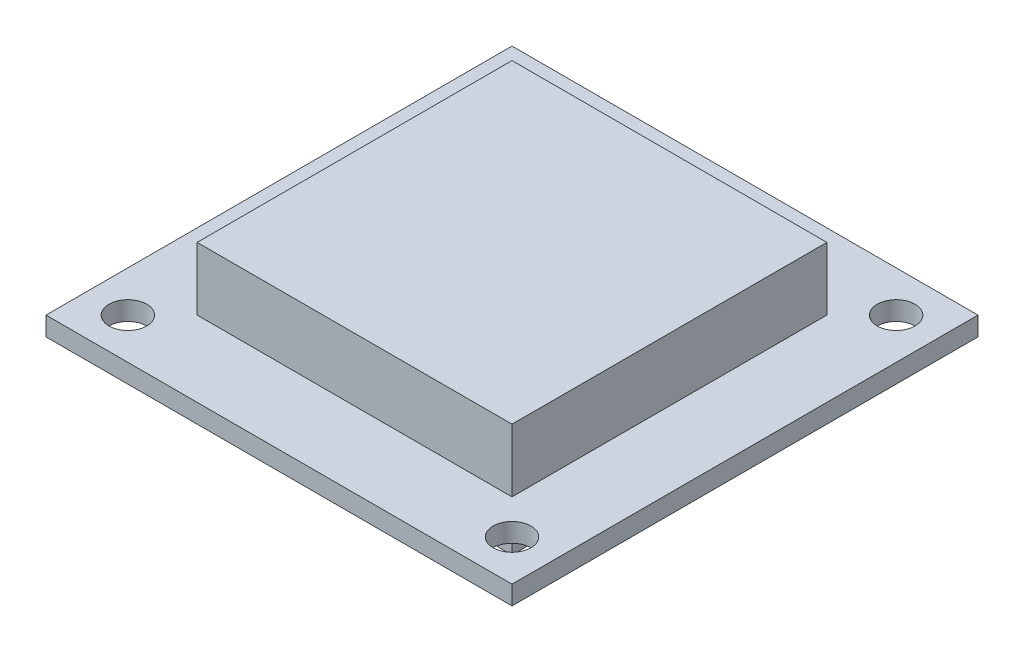
ISO-10303-21;
HEADER;
FILE_DESCRIPTION(('STEP AP214'),'2;1');
FILE_NAME('part.step','',(''),(''),'','','');
FILE_SCHEMA(('AUTOMOTIVE_DESIGN { 1 0 10303 214 1 1 1 1 }'));
ENDSEC;
DATA;
#1=APPLICATION_CONTEXT('core data for automotive mechanical design processes');
#2=APPLICATION_PROTOCOL_DEFINITION('international standard','automotive_design',2000,#1);
#3=PRODUCT_CONTEXT('',#1,'mechanical');
#4=PRODUCT('Part','Part','',(#3));
#5=PRODUCT_RELATED_PRODUCT_CATEGORY('part','',(#4));
#6=PRODUCT_DEFINITION_FORMATION('','',#4);
#7=PRODUCT_DEFINITION_CONTEXT('part definition',#1,'design');
#8=PRODUCT_DEFINITION('design','',#6,#7);
#9=PRODUCT_DEFINITION_SHAPE('','',#8);
#10=(LENGTH_UNIT() NAMED_UNIT(*) SI_UNIT(.MILLI.,.METRE.));
#11=(NAMED_UNIT(*) PLANE_ANGLE_UNIT() SI_UNIT($,.RADIAN.));
#12=(NAMED_UNIT(*) SI_UNIT($,.STERADIAN.) SOLID_ANGLE_UNIT());
#13=UNCERTAINTY_MEASURE_WITH_UNIT(LENGTH_MEASURE(1.E-05),#10,'distance_accuracy_value','');
#14=(GEOMETRIC_REPRESENTATION_CONTEXT(3) GLOBAL_UNCERTAINTY_ASSIGNED_CONTEXT((#13)) GLOBAL_UNIT_ASSIGNED_CONTEXT((#10,
#11,#12)) REPRESENTATION_CONTEXT('',''));
#15=CARTESIAN_POINT('',(0.,0.,0.));
#16=DIRECTION('',(0.,0.,1.));
#17=DIRECTION('',(1.,0.,0.));
#18=AXIS2_PLACEMENT_3D('',#15,#16,#17);
#19=CARTESIAN_POINT('',(0.,1.5,0.));
#20=DIRECTION('',(0.,-1.,0.));
#21=DIRECTION('',(0.,0.,-1.));
#22=AXIS2_PLACEMENT_3D('',#19,#20,#21);
#23=PLANE('',#22);
#24=DIRECTION('',(1.,0.,0.));
#25=VECTOR('',#24,1.);
#26=CARTESIAN_POINT('',(0.,1.5,-12.5));
#27=LINE('',#26,#25);
#28=CARTESIAN_POINT('',(-12.5,1.5,-12.5));
#29=VERTEX_POINT('',#28);
#30=CARTESIAN_POINT('',(12.5,1.5,-12.5));
#31=VERTEX_POINT('',#30);
#32=EDGE_CURVE('E178',#29,#31,#27,.T.);
#33=ORIENTED_EDGE('',*,*,#32,.T.);
#34=DIRECTION('',(0.,0.,1.));
#35=VECTOR('',#34,1.);
#36=CARTESIAN_POINT('',(12.5,1.5,0.));
#37=LINE('',#36,#35);
#38=CARTESIAN_POINT('',(12.5,1.5,12.5));
#39=VERTEX_POINT('',#38);
#40=EDGE_CURVE('E131',#31,#39,#37,.T.);
#41=ORIENTED_EDGE('',*,*,#40,.T.);
#42=DIRECTION('',(-1.,0.,0.));
#43=VECTOR('',#42,1.);
#44=CARTESIAN_POINT('',(0.,1.5,12.5));
#45=LINE('',#44,#43);
#46=CARTESIAN_POINT('',(-12.5,1.5,12.5));
#47=VERTEX_POINT('',#46);
#48=EDGE_CURVE('E197',#39,#47,#45,.T.);
#49=ORIENTED_EDGE('',*,*,#48,.T.);
#50=DIRECTION('',(0.,0.,-1.));
#51=VECTOR('',#50,1.);
#52=CARTESIAN_POINT('',(-12.5,1.5,0.));
#53=LINE('',#52,#51);
#54=EDGE_CURVE('E193',#47,#29,#53,.T.);
#55=ORIENTED_EDGE('',*,*,#54,.T.);
#56=EDGE_LOOP('',(#33,#41,#49,#55));
#57=FACE_BOUND('',#56,.T.);
#58=DIRECTION('',(0.,0.,-1.));
#59=VECTOR('',#58,1.);
#60=CARTESIAN_POINT('',(18.5,1.5,18.5));
#61=LINE('',#60,#59);
#62=CARTESIAN_POINT('',(18.5,1.5,18.5));
#63=VERTEX_POINT('',#62);
#64=CARTESIAN_POINT('',(18.5,1.5,-18.5));
#65=VERTEX_POINT('',#64);
#66=EDGE_CURVE('E236',#63,#65,#61,.T.);
#67=ORIENTED_EDGE('',*,*,#66,.T.);
#68=DIRECTION('',(-1.,0.,0.));
#69=VECTOR('',#68,1.);
#70=CARTESIAN_POINT('',(-18.5,1.5,-18.5));
#71=LINE('',#70,#69);
#72=CARTESIAN_POINT('',(-18.5,1.5,-18.5));
#73=VERTEX_POINT('',#72);
#74=EDGE_CURVE('E240',#65,#73,#71,.T.);
#75=ORIENTED_EDGE('',*,*,#74,.T.);
#76=DIRECTION('',(0.,0.,1.));
#77=VECTOR('',#76,1.);
#78=CARTESIAN_POINT('',(-18.5,1.5,18.5));
#79=LINE('',#78,#77);
#80=CARTESIAN_POINT('',(-18.5,1.5,18.5));
#81=VERTEX_POINT('',#80);
#82=EDGE_CURVE('E244',#73,#81,#79,.T.);
#83=ORIENTED_EDGE('',*,*,#82,.T.);
#84=DIRECTION('',(1.,0.,0.));
#85=VECTOR('',#84,1.);
#86=CARTESIAN_POINT('',(-18.5,1.5,18.5));
#87=LINE('',#86,#85);
#88=EDGE_CURVE('E247',#81,#63,#87,.T.);
#89=ORIENTED_EDGE('',*,*,#88,.T.);
#90=EDGE_LOOP('',(#67,#75,#83,#89));
#91=FACE_BOUND('',#90,.T.);
#92=CARTESIAN_POINT('',(-15.25,1.5,-15.25));
#93=DIRECTION('',(0.,1.,0.));
#94=DIRECTION('',(0.,0.,1.));
#95=AXIS2_PLACEMENT_3D('',#92,#93,#94);
#96=CIRCLE('',#95,1.5);
#97=CARTESIAN_POINT('',(-15.25,1.5,-13.75));
#98=VERTEX_POINT('',#97);
#99=EDGE_CURVE('E228',#98,#98,#96,.T.);
#100=ORIENTED_EDGE('',*,*,#99,.F.);
#101=EDGE_LOOP('',(#100));
#102=FACE_BOUND('',#101,.T.);
#103=CARTESIAN_POINT('',(15.25,1.5,-15.2500000000009));
#104=DIRECTION('',(0.,1.,0.));
#105=DIRECTION('',(0.,0.,1.));
#106=AXIS2_PLACEMENT_3D('',#103,#104,#105);
#107=CIRCLE('',#106,1.5);
#108=CARTESIAN_POINT('',(15.25,1.5,-13.7500000000009));
#109=VERTEX_POINT('',#108);
#110=EDGE_CURVE('E220',#109,#109,#107,.T.);
#111=ORIENTED_EDGE('',*,*,#110,.F.);
#112=EDGE_LOOP('',(#111));
#113=FACE_BOUND('',#112,.T.);
#114=CARTESIAN_POINT('',(15.2500000000009,1.5,15.2499999999991));
#115=DIRECTION('',(0.,1.,0.));
#116=DIRECTION('',(0.,0.,1.));
#117=AXIS2_PLACEMENT_3D('',#114,#115,#116);
#118=CIRCLE('',#117,1.5);
#119=CARTESIAN_POINT('',(15.2500000000009,1.5,16.7499999999991));
#120=VERTEX_POINT('',#119);
#121=EDGE_CURVE('E212',#120,#120,#118,.T.);
#122=ORIENTED_EDGE('',*,*,#121,.F.);
#123=EDGE_LOOP('',(#122));
#124=FACE_BOUND('',#123,.T.);
#125=CARTESIAN_POINT('',(-15.2499999999991,1.5,15.25));
#126=DIRECTION('',(0.,1.,0.));
#127=DIRECTION('',(0.,0.,1.));
#128=AXIS2_PLACEMENT_3D('',#125,#126,#127);
#129=CIRCLE('',#128,1.5);
#130=CARTESIAN_POINT('',(-15.2499999999991,1.5,16.75));
#131=VERTEX_POINT('',#130);
#132=EDGE_CURVE('E204',#131,#131,#129,.T.);
#133=ORIENTED_EDGE('',*,*,#132,.F.);
#134=EDGE_LOOP('',(#133));
#135=FACE_BOUND('',#134,.T.);
#136=ADVANCED_FACE('F39',(#57,#91,#102,#113,#124,#135),#23,.F.);
#137=CARTESIAN_POINT('',(0.,0.,0.));
#138=DIRECTION('',(0.,-1.,0.));
#139=DIRECTION('',(0.,0.,-1.));
#140=AXIS2_PLACEMENT_3D('',#137,#138,#139);
#141=PLANE('',#140);
#142=DIRECTION('',(0.,0.,1.));
#143=VECTOR('',#142,1.);
#144=CARTESIAN_POINT('',(12.5,0.,0.));
#145=LINE('',#144,#143);
#146=CARTESIAN_POINT('',(12.5,0.,-12.5));
#147=VERTEX_POINT('',#146);
#148=CARTESIAN_POINT('',(12.5,0.,12.5));
#149=VERTEX_POINT('',#148);
#150=EDGE_CURVE('E11',#147,#149,#145,.T.);
#151=ORIENTED_EDGE('',*,*,#150,.F.);
#152=DIRECTION('',(1.,0.,0.));
#153=VECTOR('',#152,1.);
#154=CARTESIAN_POINT('',(0.,0.,-12.5));
#155=LINE('',#154,#153);
#156=CARTESIAN_POINT('',(-12.5,0.,-12.5));
#157=VERTEX_POINT('',#156);
#158=EDGE_CURVE('E277',#157,#147,#155,.T.);
#159=ORIENTED_EDGE('',*,*,#158,.F.);
#160=DIRECTION('',(0.,0.,-1.));
#161=VECTOR('',#160,1.);
#162=CARTESIAN_POINT('',(-12.5,0.,0.));
#163=LINE('',#162,#161);
#164=CARTESIAN_POINT('',(-12.5,0.,12.5));
#165=VERTEX_POINT('',#164);
#166=EDGE_CURVE('E281',#165,#157,#163,.T.);
#167=ORIENTED_EDGE('',*,*,#166,.F.);
#168=DIRECTION('',(-1.,0.,0.));
#169=VECTOR('',#168,1.);
#170=CARTESIAN_POINT('',(0.,0.,12.5));
#171=LINE('',#170,#169);
#172=EDGE_CURVE('E48',#149,#165,#171,.T.);
#173=ORIENTED_EDGE('',*,*,#172,.F.);
#174=EDGE_LOOP('',(#151,#159,#167,#173));
#175=FACE_BOUND('',#174,.T.);
#176=CARTESIAN_POINT('',(15.2500000000009,0.,15.2499999999991));
#177=DIRECTION('',(0.,1.,0.));
#178=DIRECTION('',(0.,0.,1.));
#179=AXIS2_PLACEMENT_3D('',#176,#177,#178);
#180=CIRCLE('',#179,1.5);
#181=CARTESIAN_POINT('',(15.2500000000009,0.,16.7499999999991));
#182=VERTEX_POINT('',#181);
#183=EDGE_CURVE('E208',#182,#182,#180,.T.);
#184=ORIENTED_EDGE('',*,*,#183,.T.);
#185=EDGE_LOOP('',(#184));
#186=FACE_BOUND('',#185,.T.);
#187=CARTESIAN_POINT('',(-15.25,0.,-15.25));
#188=DIRECTION('',(0.,1.,0.));
#189=DIRECTION('',(0.,0.,1.));
#190=AXIS2_PLACEMENT_3D('',#187,#188,#189);
#191=CIRCLE('',#190,1.5);
#192=CARTESIAN_POINT('',(-15.25,0.,-13.75));
#193=VERTEX_POINT('',#192);
#194=EDGE_CURVE('E224',#193,#193,#191,.T.);
#195=ORIENTED_EDGE('',*,*,#194,.T.);
#196=EDGE_LOOP('',(#195));
#197=FACE_BOUND('',#196,.T.);
#198=DIRECTION('',(0.,0.,-1.));
#199=VECTOR('',#198,1.);
#200=CARTESIAN_POINT('',(18.5,0.,18.5));
#201=LINE('',#200,#199);
#202=CARTESIAN_POINT('',(18.5,0.,18.5));
#203=VERTEX_POINT('',#202);
#204=CARTESIAN_POINT('',(18.5,0.,-18.5));
#205=VERTEX_POINT('',#204);
#206=EDGE_CURVE('E232',#203,#205,#201,.T.);
#207=ORIENTED_EDGE('',*,*,#206,.F.);
#208=DIRECTION('',(1.,0.,0.));
#209=VECTOR('',#208,1.);
#210=CARTESIAN_POINT('',(-18.5,0.,18.5));
#211=LINE('',#210,#209);
#212=CARTESIAN_POINT('',(-18.5,0.,18.5));
#213=VERTEX_POINT('',#212);
#214=EDGE_CURVE('E241',#213,#203,#211,.T.);
#215=ORIENTED_EDGE('',*,*,#214,.F.);
#216=DIRECTION('',(0.,0.,1.));
#217=VECTOR('',#216,1.);
#218=CARTESIAN_POINT('',(-18.5,0.,18.5));
#219=LINE('',#218,#217);
#220=CARTESIAN_POINT('',(-18.5,0.,-18.5));
#221=VERTEX_POINT('',#220);
#222=EDGE_CURVE('E257',#221,#213,#219,.T.);
#223=ORIENTED_EDGE('',*,*,#222,.F.);
#224=DIRECTION('',(-1.,0.,0.));
#225=VECTOR('',#224,1.);
#226=CARTESIAN_POINT('',(-18.5,0.,-18.5));
#227=LINE('',#226,#225);
#228=EDGE_CURVE('E254',#205,#221,#227,.T.);
#229=ORIENTED_EDGE('',*,*,#228,.F.);
#230=EDGE_LOOP('',(#207,#215,#223,#229));
#231=FACE_BOUND('',#230,.T.);
#232=CARTESIAN_POINT('',(15.25,0.,-15.2500000000009));
#233=DIRECTION('',(0.,1.,0.));
#234=DIRECTION('',(0.,0.,1.));
#235=AXIS2_PLACEMENT_3D('',#232,#233,#234);
#236=CIRCLE('',#235,1.5);
#237=CARTESIAN_POINT('',(15.25,0.,-13.7500000000009));
#238=VERTEX_POINT('',#237);
#239=EDGE_CURVE('E216',#238,#238,#236,.T.);
#240=ORIENTED_EDGE('',*,*,#239,.T.);
#241=EDGE_LOOP('',(#240));
#242=FACE_BOUND('',#241,.T.);
#243=CARTESIAN_POINT('',(-15.2499999999991,0.,15.25));
#244=DIRECTION('',(0.,1.,0.));
#245=DIRECTION('',(0.,0.,1.));
#246=AXIS2_PLACEMENT_3D('',#243,#244,#245);
#247=CIRCLE('',#246,1.5);
#248=CARTESIAN_POINT('',(-15.2499999999991,0.,16.75));
#249=VERTEX_POINT('',#248);
#250=EDGE_CURVE('E203',#249,#249,#247,.T.);
#251=ORIENTED_EDGE('',*,*,#250,.T.);
#252=EDGE_LOOP('',(#251));
#253=FACE_BOUND('',#252,.T.);
#254=ADVANCED_FACE('F297',(#175,#186,#197,#231,#242,#253),#141,.T.);
#255=CARTESIAN_POINT('',(18.5,1.5,18.5));
#256=DIRECTION('',(-1.,0.,0.));
#257=DIRECTION('',(0.,0.,1.));
#258=AXIS2_PLACEMENT_3D('',#255,#256,#257);
#259=PLANE('',#258);
#260=ORIENTED_EDGE('',*,*,#206,.T.);
#261=DIRECTION('',(0.,-1.,0.));
#262=VECTOR('',#261,1.);
#263=CARTESIAN_POINT('',(18.5,1.5,-18.5));
#264=LINE('',#263,#262);
#265=EDGE_CURVE('E273',#65,#205,#264,.T.);
#266=ORIENTED_EDGE('',*,*,#265,.F.);
#267=ORIENTED_EDGE('',*,*,#66,.F.);
#268=DIRECTION('',(0.,-1.,0.));
#269=VECTOR('',#268,1.);
#270=CARTESIAN_POINT('',(18.5,1.5,18.5));
#271=LINE('',#270,#269);
#272=EDGE_CURVE('E250',#63,#203,#271,.T.);
#273=ORIENTED_EDGE('',*,*,#272,.T.);
#274=EDGE_LOOP('',(#260,#266,#267,#273));
#275=FACE_BOUND('',#274,.T.);
#276=ADVANCED_FACE('F41',(#275),#259,.F.);
#277=CARTESIAN_POINT('',(-18.5,1.5,-18.5));
#278=DIRECTION('',(0.,0.,1.));
#279=DIRECTION('',(1.,0.,0.));
#280=AXIS2_PLACEMENT_3D('',#277,#278,#279);
#281=PLANE('',#280);
#282=ORIENTED_EDGE('',*,*,#228,.T.);
#283=DIRECTION('',(0.,-1.,0.));
#284=VECTOR('',#283,1.);
#285=CARTESIAN_POINT('',(-18.5,1.5,-18.5));
#286=LINE('',#285,#284);
#287=EDGE_CURVE('E269',#73,#221,#286,.T.);
#288=ORIENTED_EDGE('',*,*,#287,.F.);
#289=ORIENTED_EDGE('',*,*,#74,.F.);
#290=ORIENTED_EDGE('',*,*,#265,.T.);
#291=EDGE_LOOP('',(#282,#288,#289,#290));
#292=FACE_BOUND('',#291,.T.);
#293=ADVANCED_FACE('F331',(#292),#281,.F.);
#294=CARTESIAN_POINT('',(-18.5,1.5,18.5));
#295=DIRECTION('',(1.,0.,0.));
#296=DIRECTION('',(0.,0.,-1.));
#297=AXIS2_PLACEMENT_3D('',#294,#295,#296);
#298=PLANE('',#297);
#299=ORIENTED_EDGE('',*,*,#222,.T.);
#300=DIRECTION('',(0.,-1.,0.));
#301=VECTOR('',#300,1.);
#302=CARTESIAN_POINT('',(-18.5,1.5,18.5));
#303=LINE('',#302,#301);
#304=EDGE_CURVE('E265',#81,#213,#303,.T.);
#305=ORIENTED_EDGE('',*,*,#304,.F.);
#306=ORIENTED_EDGE('',*,*,#82,.F.);
#307=ORIENTED_EDGE('',*,*,#287,.T.);
#308=EDGE_LOOP('',(#299,#305,#306,#307));
#309=FACE_BOUND('',#308,.T.);
#310=ADVANCED_FACE('F328',(#309),#298,.F.);
#311=CARTESIAN_POINT('',(-18.5,1.5,18.5));
#312=DIRECTION('',(0.,0.,-1.));
#313=DIRECTION('',(-1.,0.,0.));
#314=AXIS2_PLACEMENT_3D('',#311,#312,#313);
#315=PLANE('',#314);
#316=ORIENTED_EDGE('',*,*,#214,.T.);
#317=ORIENTED_EDGE('',*,*,#272,.F.);
#318=ORIENTED_EDGE('',*,*,#88,.F.);
#319=ORIENTED_EDGE('',*,*,#304,.T.);
#320=EDGE_LOOP('',(#316,#317,#318,#319));
#321=FACE_BOUND('',#320,.T.);
#322=ADVANCED_FACE('F325',(#321),#315,.F.);
#323=CARTESIAN_POINT('',(-15.25,1.5,-15.25));
#324=DIRECTION('',(0.,-1.,0.));
#325=DIRECTION('',(0.,0.,-1.));
#326=AXIS2_PLACEMENT_3D('',#323,#324,#325);
#327=CYLINDRICAL_SURFACE('',#326,1.5);
#328=ORIENTED_EDGE('',*,*,#99,.T.);
#329=EDGE_LOOP('',(#328));
#330=FACE_BOUND('',#329,.T.);
#331=ORIENTED_EDGE('',*,*,#194,.F.);
#332=EDGE_LOOP('',(#331));
#333=FACE_BOUND('',#332,.T.);
#334=ADVANCED_FACE('F322',(#330,#333),#327,.F.);
#335=CARTESIAN_POINT('',(15.25,1.5,-15.2500000000009));
#336=DIRECTION('',(0.,-1.,0.));
#337=DIRECTION('',(0.,0.,-1.));
#338=AXIS2_PLACEMENT_3D('',#335,#336,#337);
#339=CYLINDRICAL_SURFACE('',#338,1.5);
#340=ORIENTED_EDGE('',*,*,#110,.T.);
#341=EDGE_LOOP('',(#340));
#342=FACE_BOUND('',#341,.T.);
#343=ORIENTED_EDGE('',*,*,#239,.F.);
#344=EDGE_LOOP('',(#343));
#345=FACE_BOUND('',#344,.T.);
#346=ADVANCED_FACE('F369',(#342,#345),#339,.F.);
#347=CARTESIAN_POINT('',(15.2500000000009,1.5,15.2499999999991));
#348=DIRECTION('',(0.,-1.,0.));
#349=DIRECTION('',(0.,0.,-1.));
#350=AXIS2_PLACEMENT_3D('',#347,#348,#349);
#351=CYLINDRICAL_SURFACE('',#350,1.5);
#352=ORIENTED_EDGE('',*,*,#121,.T.);
#353=EDGE_LOOP('',(#352));
#354=FACE_BOUND('',#353,.T.);
#355=ORIENTED_EDGE('',*,*,#183,.F.);
#356=EDGE_LOOP('',(#355));
#357=FACE_BOUND('',#356,.T.);
#358=ADVANCED_FACE('F362',(#354,#357),#351,.F.);
#359=CARTESIAN_POINT('',(-15.2499999999991,1.5,15.25));
#360=DIRECTION('',(0.,-1.,0.));
#361=DIRECTION('',(0.,0.,-1.));
#362=AXIS2_PLACEMENT_3D('',#359,#360,#361);
#363=CYLINDRICAL_SURFACE('',#362,1.5);
#364=ORIENTED_EDGE('',*,*,#132,.T.);
#365=EDGE_LOOP('',(#364));
#366=FACE_BOUND('',#365,.T.);
#367=ORIENTED_EDGE('',*,*,#250,.F.);
#368=EDGE_LOOP('',(#367));
#369=FACE_BOUND('',#368,.T.);
#370=ADVANCED_FACE('F309',(#366,#369),#363,.F.);
#371=CARTESIAN_POINT('',(0.,-2.5,0.));
#372=DIRECTION('',(0.,-1.,0.));
#373=DIRECTION('',(0.,0.,-1.));
#374=AXIS2_PLACEMENT_3D('',#371,#372,#373);
#375=PLANE('',#374);
#376=DIRECTION('',(0.,0.,-1.));
#377=VECTOR('',#376,1.);
#378=CARTESIAN_POINT('',(12.5,-2.5,12.5));
#379=LINE('',#378,#377);
#380=CARTESIAN_POINT('',(12.5,-2.5,12.5));
#381=VERTEX_POINT('',#380);
#382=CARTESIAN_POINT('',(12.5,-2.5,-12.5));
#383=VERTEX_POINT('',#382);
#384=EDGE_CURVE('E159',#381,#383,#379,.T.);
#385=ORIENTED_EDGE('',*,*,#384,.F.);
#386=DIRECTION('',(1.,0.,0.));
#387=VECTOR('',#386,1.);
#388=CARTESIAN_POINT('',(-12.5,-2.5,12.5));
#389=LINE('',#388,#387);
#390=CARTESIAN_POINT('',(-12.5,-2.5,12.5));
#391=VERTEX_POINT('',#390);
#392=EDGE_CURVE('E135',#391,#381,#389,.T.);
#393=ORIENTED_EDGE('',*,*,#392,.F.);
#394=DIRECTION('',(0.,0.,1.));
#395=VECTOR('',#394,1.);
#396=CARTESIAN_POINT('',(-12.5,-2.5,12.5));
#397=LINE('',#396,#395);
#398=CARTESIAN_POINT('',(-12.5,-2.5,-12.5));
#399=VERTEX_POINT('',#398);
#400=EDGE_CURVE('E167',#399,#391,#397,.T.);
#401=ORIENTED_EDGE('',*,*,#400,.F.);
#402=DIRECTION('',(-1.,0.,0.));
#403=VECTOR('',#402,1.);
#404=CARTESIAN_POINT('',(-12.5,-2.5,-12.5));
#405=LINE('',#404,#403);
#406=EDGE_CURVE('E163',#383,#399,#405,.T.);
#407=ORIENTED_EDGE('',*,*,#406,.F.);
#408=EDGE_LOOP('',(#385,#393,#401,#407));
#409=FACE_BOUND('',#408,.T.);
#410=ADVANCED_FACE('F294',(#409),#375,.T.);
#411=CARTESIAN_POINT('',(-12.5,-2.5,-12.5));
#412=DIRECTION('',(0.,0.,-1.));
#413=DIRECTION('',(-1.,0.,0.));
#414=AXIS2_PLACEMENT_3D('',#411,#412,#413);
#415=PLANE('',#414);
#416=DIRECTION('',(0.,1.,0.));
#417=VECTOR('',#416,1.);
#418=CARTESIAN_POINT('',(-12.5,-2.5,-12.5));
#419=LINE('',#418,#417);
#420=EDGE_CURVE('E185',#399,#157,#419,.T.);
#421=ORIENTED_EDGE('',*,*,#420,.T.);
#422=ORIENTED_EDGE('',*,*,#158,.T.);
#423=DIRECTION('',(0.,1.,0.));
#424=VECTOR('',#423,1.);
#425=CARTESIAN_POINT('',(12.5,-2.5,-12.5));
#426=LINE('',#425,#424);
#427=EDGE_CURVE('E134',#383,#147,#426,.T.);
#428=ORIENTED_EDGE('',*,*,#427,.F.);
#429=ORIENTED_EDGE('',*,*,#406,.T.);
#430=EDGE_LOOP('',(#421,#422,#428,#429));
#431=FACE_BOUND('',#430,.T.);
#432=ADVANCED_FACE('F300',(#431),#415,.T.);
#433=CARTESIAN_POINT('',(-12.5,-2.5,12.5));
#434=DIRECTION('',(-1.,0.,0.));
#435=DIRECTION('',(0.,0.,1.));
#436=AXIS2_PLACEMENT_3D('',#433,#434,#435);
#437=PLANE('',#436);
#438=DIRECTION('',(0.,1.,0.));
#439=VECTOR('',#438,1.);
#440=CARTESIAN_POINT('',(-12.5,-2.5,12.5));
#441=LINE('',#440,#439);
#442=EDGE_CURVE('E180',#391,#165,#441,.T.);
#443=ORIENTED_EDGE('',*,*,#442,.T.);
#444=ORIENTED_EDGE('',*,*,#166,.T.);
#445=ORIENTED_EDGE('',*,*,#420,.F.);
#446=ORIENTED_EDGE('',*,*,#400,.T.);
#447=EDGE_LOOP('',(#443,#444,#445,#446));
#448=FACE_BOUND('',#447,.T.);
#449=ADVANCED_FACE('F288',(#448),#437,.T.);
#450=CARTESIAN_POINT('',(-12.5,-2.5,12.5));
#451=DIRECTION('',(0.,0.,1.));
#452=DIRECTION('',(1.,0.,0.));
#453=AXIS2_PLACEMENT_3D('',#450,#451,#452);
#454=PLANE('',#453);
#455=DIRECTION('',(0.,1.,0.));
#456=VECTOR('',#455,1.);
#457=CARTESIAN_POINT('',(12.5,-2.5,12.5));
#458=LINE('',#457,#456);
#459=EDGE_CURVE('E174',#381,#149,#458,.T.);
#460=ORIENTED_EDGE('',*,*,#459,.T.);
#461=ORIENTED_EDGE('',*,*,#172,.T.);
#462=ORIENTED_EDGE('',*,*,#442,.F.);
#463=ORIENTED_EDGE('',*,*,#392,.T.);
#464=EDGE_LOOP('',(#460,#461,#462,#463));
#465=FACE_BOUND('',#464,.T.);
#466=ADVANCED_FACE('F286',(#465),#454,.T.);
#467=CARTESIAN_POINT('',(12.5,-2.5,12.5));
#468=DIRECTION('',(1.,0.,0.));
#469=DIRECTION('',(0.,0.,-1.));
#470=AXIS2_PLACEMENT_3D('',#467,#468,#469);
#471=PLANE('',#470);
#472=ORIENTED_EDGE('',*,*,#427,.T.);
#473=ORIENTED_EDGE('',*,*,#150,.T.);
#474=ORIENTED_EDGE('',*,*,#459,.F.);
#475=ORIENTED_EDGE('',*,*,#384,.T.);
#476=EDGE_LOOP('',(#472,#473,#474,#475));
#477=FACE_BOUND('',#476,.T.);
#478=ADVANCED_FACE('F296',(#477),#471,.T.);
#479=ORIENTED_EDGE('',*,*,#40,.F.);
#480=CARTESIAN_POINT('',(12.5,6.5,-12.5));
#481=VERTEX_POINT('',#480);
#482=EDGE_CURVE('E55',#31,#481,#426,.T.);
#483=ORIENTED_EDGE('',*,*,#482,.T.);
#484=DIRECTION('',(0.,0.,-1.));
#485=VECTOR('',#484,1.);
#486=CARTESIAN_POINT('',(12.5,6.5,12.5));
#487=LINE('',#486,#485);
#488=CARTESIAN_POINT('',(12.5,6.5,12.5));
#489=VERTEX_POINT('',#488);
#490=EDGE_CURVE('E129',#489,#481,#487,.T.);
#491=ORIENTED_EDGE('',*,*,#490,.F.);
#492=EDGE_CURVE('E179',#39,#489,#458,.T.);
#493=ORIENTED_EDGE('',*,*,#492,.F.);
#494=EDGE_LOOP('',(#479,#483,#491,#493));
#495=FACE_BOUND('',#494,.T.);
#496=ADVANCED_FACE('F126',(#495),#471,.T.);
#497=ORIENTED_EDGE('',*,*,#48,.F.);
#498=ORIENTED_EDGE('',*,*,#492,.T.);
#499=DIRECTION('',(1.,0.,0.));
#500=VECTOR('',#499,1.);
#501=CARTESIAN_POINT('',(-12.5,6.5,12.5));
#502=LINE('',#501,#500);
#503=CARTESIAN_POINT('',(-12.5,6.5,12.5));
#504=VERTEX_POINT('',#503);
#505=EDGE_CURVE('E151',#504,#489,#502,.T.);
#506=ORIENTED_EDGE('',*,*,#505,.F.);
#507=EDGE_CURVE('E184',#47,#504,#441,.T.);
#508=ORIENTED_EDGE('',*,*,#507,.F.);
#509=EDGE_LOOP('',(#497,#498,#506,#508));
#510=FACE_BOUND('',#509,.T.);
#511=ADVANCED_FACE('F438',(#510),#454,.T.);
#512=ORIENTED_EDGE('',*,*,#54,.F.);
#513=ORIENTED_EDGE('',*,*,#507,.T.);
#514=DIRECTION('',(0.,0.,1.));
#515=VECTOR('',#514,1.);
#516=CARTESIAN_POINT('',(-12.5,6.5,12.5));
#517=LINE('',#516,#515);
#518=CARTESIAN_POINT('',(-12.5,6.5,-12.5));
#519=VERTEX_POINT('',#518);
#520=EDGE_CURVE('E146',#519,#504,#517,.T.);
#521=ORIENTED_EDGE('',*,*,#520,.F.);
#522=EDGE_CURVE('E141',#29,#519,#419,.T.);
#523=ORIENTED_EDGE('',*,*,#522,.F.);
#524=EDGE_LOOP('',(#512,#513,#521,#523));
#525=FACE_BOUND('',#524,.T.);
#526=ADVANCED_FACE('F308',(#525),#437,.T.);
#527=ORIENTED_EDGE('',*,*,#32,.F.);
#528=ORIENTED_EDGE('',*,*,#522,.T.);
#529=DIRECTION('',(-1.,0.,0.));
#530=VECTOR('',#529,1.);
#531=CARTESIAN_POINT('',(-12.5,6.5,-12.5));
#532=LINE('',#531,#530);
#533=EDGE_CURVE('E138',#481,#519,#532,.T.);
#534=ORIENTED_EDGE('',*,*,#533,.F.);
#535=ORIENTED_EDGE('',*,*,#482,.F.);
#536=EDGE_LOOP('',(#527,#528,#534,#535));
#537=FACE_BOUND('',#536,.T.);
#538=ADVANCED_FACE('F139',(#537),#415,.T.);
#539=CARTESIAN_POINT('',(0.,6.5,0.));
#540=DIRECTION('',(0.,-1.,0.));
#541=DIRECTION('',(0.,0.,-1.));
#542=AXIS2_PLACEMENT_3D('',#539,#540,#541);
#543=PLANE('',#542);
#544=ORIENTED_EDGE('',*,*,#490,.T.);
#545=ORIENTED_EDGE('',*,*,#533,.T.);
#546=ORIENTED_EDGE('',*,*,#520,.T.);
#547=ORIENTED_EDGE('',*,*,#505,.T.);
#548=EDGE_LOOP('',(#544,#545,#546,#547));
#549=FACE_BOUND('',#548,.T.);
#550=ADVANCED_FACE('F149',(#549),#543,.F.);
#551=CLOSED_SHELL('',(#136,#254,#276,#293,#310,#322,#334,#346,#358,#370,#410,#432,#449,#466,
#478,#496,#511,#526,#538,#550));
#552=MANIFOLD_SOLID_BREP('B2',#551);
#553=ADVANCED_BREP_SHAPE_REPRESENTATION('',(#18,#552),#14);
#554=SHAPE_DEFINITION_REPRESENTATION(#9,#553);
ENDSEC;
END-ISO-10303-21;
